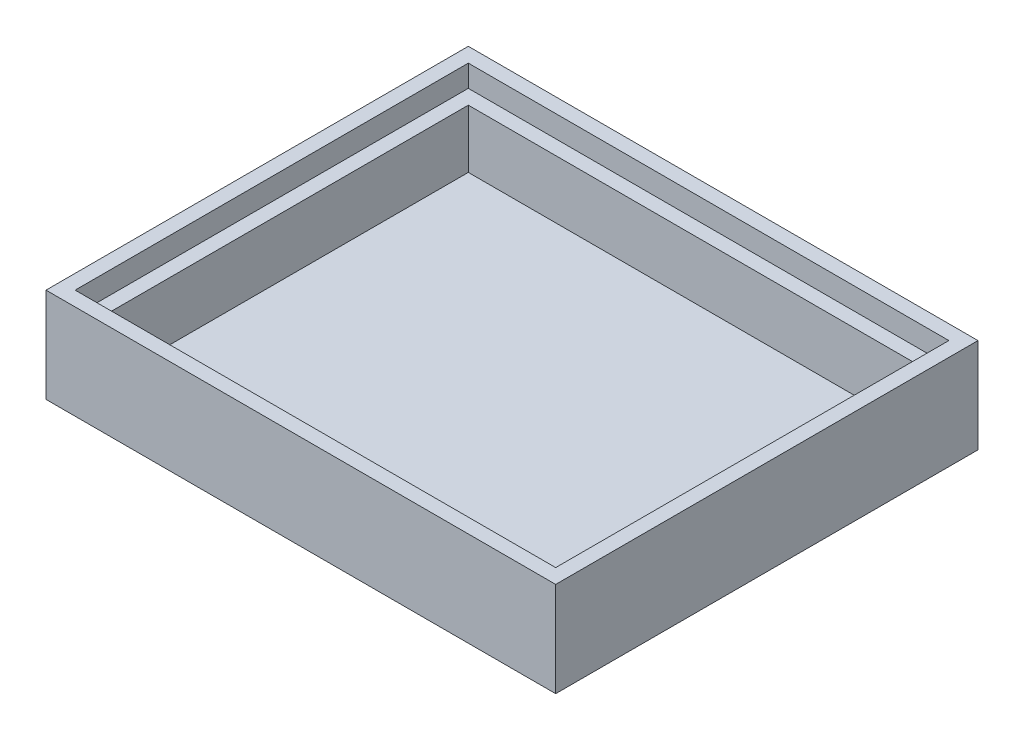
ISO-10303-21;
HEADER;
FILE_DESCRIPTION(('STEP AP214'),'2;1');
FILE_NAME('part.step','',(''),(''),'','','');
FILE_SCHEMA(('AUTOMOTIVE_DESIGN { 1 0 10303 214 1 1 1 1 }'));
ENDSEC;
DATA;
#1=APPLICATION_CONTEXT('core data for automotive mechanical design processes');
#2=APPLICATION_PROTOCOL_DEFINITION('international standard','automotive_design',2000,#1);
#3=PRODUCT_CONTEXT('',#1,'mechanical');
#4=PRODUCT('Part','Part','',(#3));
#5=PRODUCT_RELATED_PRODUCT_CATEGORY('part','',(#4));
#6=PRODUCT_DEFINITION_FORMATION('','',#4);
#7=PRODUCT_DEFINITION_CONTEXT('part definition',#1,'design');
#8=PRODUCT_DEFINITION('design','',#6,#7);
#9=PRODUCT_DEFINITION_SHAPE('','',#8);
#10=(LENGTH_UNIT() NAMED_UNIT(*) SI_UNIT(.MILLI.,.METRE.));
#11=(NAMED_UNIT(*) PLANE_ANGLE_UNIT() SI_UNIT($,.RADIAN.));
#12=(NAMED_UNIT(*) SI_UNIT($,.STERADIAN.) SOLID_ANGLE_UNIT());
#13=UNCERTAINTY_MEASURE_WITH_UNIT(LENGTH_MEASURE(1.E-05),#10,'distance_accuracy_value','');
#14=(GEOMETRIC_REPRESENTATION_CONTEXT(3) GLOBAL_UNCERTAINTY_ASSIGNED_CONTEXT((#13)) GLOBAL_UNIT_ASSIGNED_CONTEXT((#10,
#11,#12)) REPRESENTATION_CONTEXT('',''));
#15=CARTESIAN_POINT('',(0.,0.,0.));
#16=DIRECTION('',(0.,0.,1.));
#17=DIRECTION('',(1.,0.,0.));
#18=AXIS2_PLACEMENT_3D('',#15,#16,#17);
#19=CARTESIAN_POINT('',(0.,10.,0.));
#20=DIRECTION('',(0.,1.,0.));
#21=DIRECTION('',(0.,0.,1.));
#22=AXIS2_PLACEMENT_3D('',#19,#20,#21);
#23=PLANE('',#22);
#24=DIRECTION('',(1.,0.,0.));
#25=VECTOR('',#24,1.);
#26=CARTESIAN_POINT('',(4.00000000000001,10.,-4.));
#27=LINE('',#26,#25);
#28=CARTESIAN_POINT('',(4.00000000000001,10.,-4.));
#29=VERTEX_POINT('',#28);
#30=CARTESIAN_POINT('',(66.,10.,-4.));
#31=VERTEX_POINT('',#30);
#32=EDGE_CURVE('E202',#29,#31,#27,.T.);
#33=ORIENTED_EDGE('',*,*,#32,.F.);
#34=DIRECTION('',(0.,0.,1.));
#35=VECTOR('',#34,1.);
#36=CARTESIAN_POINT('',(4.,10.,-54.));
#37=LINE('',#36,#35);
#38=CARTESIAN_POINT('',(4.,10.,-54.));
#39=VERTEX_POINT('',#38);
#40=EDGE_CURVE('E199',#39,#29,#37,.T.);
#41=ORIENTED_EDGE('',*,*,#40,.F.);
#42=DIRECTION('',(-1.,0.,0.));
#43=VECTOR('',#42,1.);
#44=CARTESIAN_POINT('',(4.,10.,-54.));
#45=LINE('',#44,#43);
#46=CARTESIAN_POINT('',(66.,10.,-54.));
#47=VERTEX_POINT('',#46);
#48=EDGE_CURVE('E210',#47,#39,#45,.T.);
#49=ORIENTED_EDGE('',*,*,#48,.F.);
#50=DIRECTION('',(0.,0.,-1.));
#51=VECTOR('',#50,1.);
#52=CARTESIAN_POINT('',(66.,10.,-54.));
#53=LINE('',#52,#51);
#54=EDGE_CURVE('E206',#31,#47,#53,.T.);
#55=ORIENTED_EDGE('',*,*,#54,.F.);
#56=EDGE_LOOP('',(#33,#41,#49,#55));
#57=FACE_BOUND('',#56,.T.);
#58=DIRECTION('',(-1.,0.,0.));
#59=VECTOR('',#58,1.);
#60=CARTESIAN_POINT('',(2.,10.,-56.));
#61=LINE('',#60,#59);
#62=CARTESIAN_POINT('',(68.,10.,-56.));
#63=VERTEX_POINT('',#62);
#64=CARTESIAN_POINT('',(2.,10.,-56.));
#65=VERTEX_POINT('',#64);
#66=EDGE_CURVE('E141',#63,#65,#61,.T.);
#67=ORIENTED_EDGE('',*,*,#66,.T.);
#68=DIRECTION('',(0.,0.,1.));
#69=VECTOR('',#68,1.);
#70=CARTESIAN_POINT('',(2.,10.,-56.));
#71=LINE('',#70,#69);
#72=CARTESIAN_POINT('',(2.00000000000001,10.,-2.));
#73=VERTEX_POINT('',#72);
#74=EDGE_CURVE('E164',#65,#73,#71,.T.);
#75=ORIENTED_EDGE('',*,*,#74,.T.);
#76=DIRECTION('',(1.,0.,0.));
#77=VECTOR('',#76,1.);
#78=CARTESIAN_POINT('',(2.00000000000001,10.,-2.));
#79=LINE('',#78,#77);
#80=CARTESIAN_POINT('',(68.,10.,-2.));
#81=VERTEX_POINT('',#80);
#82=EDGE_CURVE('E147',#73,#81,#79,.T.);
#83=ORIENTED_EDGE('',*,*,#82,.T.);
#84=DIRECTION('',(0.,0.,-1.));
#85=VECTOR('',#84,1.);
#86=CARTESIAN_POINT('',(68.,10.,-56.));
#87=LINE('',#86,#85);
#88=EDGE_CURVE('E169',#81,#63,#87,.T.);
#89=ORIENTED_EDGE('',*,*,#88,.T.);
#90=EDGE_LOOP('',(#67,#75,#83,#89));
#91=FACE_BOUND('',#90,.T.);
#92=ADVANCED_FACE('F39',(#57,#91),#23,.T.);
#93=CARTESIAN_POINT('',(4.,10.,-54.));
#94=DIRECTION('',(1.,0.,0.));
#95=DIRECTION('',(0.,0.,-1.));
#96=AXIS2_PLACEMENT_3D('',#93,#94,#95);
#97=PLANE('',#96);
#98=DIRECTION('',(0.,0.,1.));
#99=VECTOR('',#98,1.);
#100=CARTESIAN_POINT('',(4.,2.,-54.));
#101=LINE('',#100,#99);
#102=CARTESIAN_POINT('',(4.,2.,-54.));
#103=VERTEX_POINT('',#102);
#104=CARTESIAN_POINT('',(4.00000000000001,2.,-4.));
#105=VERTEX_POINT('',#104);
#106=EDGE_CURVE('E198',#103,#105,#101,.T.);
#107=ORIENTED_EDGE('',*,*,#106,.F.);
#108=DIRECTION('',(0.,-1.,0.));
#109=VECTOR('',#108,1.);
#110=CARTESIAN_POINT('',(4.,10.,-54.));
#111=LINE('',#110,#109);
#112=EDGE_CURVE('E63',#39,#103,#111,.T.);
#113=ORIENTED_EDGE('',*,*,#112,.F.);
#114=ORIENTED_EDGE('',*,*,#40,.T.);
#115=DIRECTION('',(0.,-1.,0.));
#116=VECTOR('',#115,1.);
#117=CARTESIAN_POINT('',(4.00000000000001,10.,-4.));
#118=LINE('',#117,#116);
#119=EDGE_CURVE('E235',#29,#105,#118,.T.);
#120=ORIENTED_EDGE('',*,*,#119,.T.);
#121=EDGE_LOOP('',(#107,#113,#114,#120));
#122=FACE_BOUND('',#121,.T.);
#123=ADVANCED_FACE('F285',(#122),#97,.T.);
#124=CARTESIAN_POINT('',(4.00000000000001,10.,-4.));
#125=DIRECTION('',(0.,0.,-1.));
#126=DIRECTION('',(-1.,0.,0.));
#127=AXIS2_PLACEMENT_3D('',#124,#125,#126);
#128=PLANE('',#127);
#129=DIRECTION('',(1.,0.,0.));
#130=VECTOR('',#129,1.);
#131=CARTESIAN_POINT('',(4.00000000000001,2.,-4.));
#132=LINE('',#131,#130);
#133=CARTESIAN_POINT('',(66.,2.,-4.));
#134=VERTEX_POINT('',#133);
#135=EDGE_CURVE('E216',#105,#134,#132,.T.);
#136=ORIENTED_EDGE('',*,*,#135,.F.);
#137=ORIENTED_EDGE('',*,*,#119,.F.);
#138=ORIENTED_EDGE('',*,*,#32,.T.);
#139=DIRECTION('',(0.,-1.,0.));
#140=VECTOR('',#139,1.);
#141=CARTESIAN_POINT('',(66.,10.,-4.));
#142=LINE('',#141,#140);
#143=EDGE_CURVE('E232',#31,#134,#142,.T.);
#144=ORIENTED_EDGE('',*,*,#143,.T.);
#145=EDGE_LOOP('',(#136,#137,#138,#144));
#146=FACE_BOUND('',#145,.T.);
#147=ADVANCED_FACE('F291',(#146),#128,.T.);
#148=CARTESIAN_POINT('',(66.,10.,-54.));
#149=DIRECTION('',(-1.,0.,0.));
#150=DIRECTION('',(0.,0.,1.));
#151=AXIS2_PLACEMENT_3D('',#148,#149,#150);
#152=PLANE('',#151);
#153=DIRECTION('',(0.,0.,-1.));
#154=VECTOR('',#153,1.);
#155=CARTESIAN_POINT('',(66.,2.,-54.));
#156=LINE('',#155,#154);
#157=CARTESIAN_POINT('',(66.,2.,-54.));
#158=VERTEX_POINT('',#157);
#159=EDGE_CURVE('E220',#134,#158,#156,.T.);
#160=ORIENTED_EDGE('',*,*,#159,.F.);
#161=ORIENTED_EDGE('',*,*,#143,.F.);
#162=ORIENTED_EDGE('',*,*,#54,.T.);
#163=DIRECTION('',(0.,-1.,0.));
#164=VECTOR('',#163,1.);
#165=CARTESIAN_POINT('',(66.,10.,-54.));
#166=LINE('',#165,#164);
#167=EDGE_CURVE('E229',#47,#158,#166,.T.);
#168=ORIENTED_EDGE('',*,*,#167,.T.);
#169=EDGE_LOOP('',(#160,#161,#162,#168));
#170=FACE_BOUND('',#169,.T.);
#171=ADVANCED_FACE('F373',(#170),#152,.T.);
#172=CARTESIAN_POINT('',(4.,10.,-54.));
#173=DIRECTION('',(0.,0.,1.));
#174=DIRECTION('',(1.,0.,0.));
#175=AXIS2_PLACEMENT_3D('',#172,#173,#174);
#176=PLANE('',#175);
#177=DIRECTION('',(-1.,0.,0.));
#178=VECTOR('',#177,1.);
#179=CARTESIAN_POINT('',(4.,2.,-54.));
#180=LINE('',#179,#178);
#181=EDGE_CURVE('E203',#158,#103,#180,.T.);
#182=ORIENTED_EDGE('',*,*,#181,.F.);
#183=ORIENTED_EDGE('',*,*,#167,.F.);
#184=ORIENTED_EDGE('',*,*,#48,.T.);
#185=ORIENTED_EDGE('',*,*,#112,.T.);
#186=EDGE_LOOP('',(#182,#183,#184,#185));
#187=FACE_BOUND('',#186,.T.);
#188=ADVANCED_FACE('F301',(#187),#176,.T.);
#189=CARTESIAN_POINT('',(0.,2.,0.));
#190=DIRECTION('',(0.,-1.,0.));
#191=DIRECTION('',(0.,0.,-1.));
#192=AXIS2_PLACEMENT_3D('',#189,#190,#191);
#193=PLANE('',#192);
#194=ORIENTED_EDGE('',*,*,#181,.T.);
#195=ORIENTED_EDGE('',*,*,#106,.T.);
#196=ORIENTED_EDGE('',*,*,#135,.T.);
#197=ORIENTED_EDGE('',*,*,#159,.T.);
#198=EDGE_LOOP('',(#194,#195,#196,#197));
#199=FACE_BOUND('',#198,.T.);
#200=ADVANCED_FACE('F298',(#199),#193,.F.);
#201=CARTESIAN_POINT('',(0.,13.,0.));
#202=DIRECTION('',(0.,1.,0.));
#203=DIRECTION('',(0.,0.,1.));
#204=AXIS2_PLACEMENT_3D('',#201,#202,#203);
#205=PLANE('',#204);
#206=DIRECTION('',(-1.,0.,0.));
#207=VECTOR('',#206,1.);
#208=CARTESIAN_POINT('',(70.,13.,-58.));
#209=LINE('',#208,#207);
#210=CARTESIAN_POINT('',(70.,13.,-58.));
#211=VERTEX_POINT('',#210);
#212=CARTESIAN_POINT('',(0.,13.,-58.));
#213=VERTEX_POINT('',#212);
#214=EDGE_CURVE('E149',#211,#213,#209,.T.);
#215=ORIENTED_EDGE('',*,*,#214,.T.);
#216=DIRECTION('',(0.,0.,1.));
#217=VECTOR('',#216,1.);
#218=CARTESIAN_POINT('',(0.,13.,-58.));
#219=LINE('',#218,#217);
#220=CARTESIAN_POINT('',(0.,13.,0.));
#221=VERTEX_POINT('',#220);
#222=EDGE_CURVE('E186',#213,#221,#219,.T.);
#223=ORIENTED_EDGE('',*,*,#222,.T.);
#224=DIRECTION('',(1.,0.,0.));
#225=VECTOR('',#224,1.);
#226=CARTESIAN_POINT('',(0.,13.,0.));
#227=LINE('',#226,#225);
#228=CARTESIAN_POINT('',(70.,13.,0.));
#229=VERTEX_POINT('',#228);
#230=EDGE_CURVE('E190',#221,#229,#227,.T.);
#231=ORIENTED_EDGE('',*,*,#230,.T.);
#232=DIRECTION('',(0.,0.,-1.));
#233=VECTOR('',#232,1.);
#234=CARTESIAN_POINT('',(70.,13.,0.));
#235=LINE('',#234,#233);
#236=EDGE_CURVE('E194',#229,#211,#235,.T.);
#237=ORIENTED_EDGE('',*,*,#236,.T.);
#238=EDGE_LOOP('',(#215,#223,#231,#237));
#239=FACE_BOUND('',#238,.T.);
#240=DIRECTION('',(1.,0.,0.));
#241=VECTOR('',#240,1.);
#242=CARTESIAN_POINT('',(2.00000000000001,13.,-2.));
#243=LINE('',#242,#241);
#244=CARTESIAN_POINT('',(2.00000000000001,13.,-2.));
#245=VERTEX_POINT('',#244);
#246=CARTESIAN_POINT('',(68.,13.,-2.));
#247=VERTEX_POINT('',#246);
#248=EDGE_CURVE('E140',#245,#247,#243,.T.);
#249=ORIENTED_EDGE('',*,*,#248,.F.);
#250=DIRECTION('',(0.,0.,1.));
#251=VECTOR('',#250,1.);
#252=CARTESIAN_POINT('',(2.,13.,-56.));
#253=LINE('',#252,#251);
#254=CARTESIAN_POINT('',(2.,13.,-56.));
#255=VERTEX_POINT('',#254);
#256=EDGE_CURVE('E131',#255,#245,#253,.T.);
#257=ORIENTED_EDGE('',*,*,#256,.F.);
#258=DIRECTION('',(-1.,0.,0.));
#259=VECTOR('',#258,1.);
#260=CARTESIAN_POINT('',(2.,13.,-56.));
#261=LINE('',#260,#259);
#262=CARTESIAN_POINT('',(68.,13.,-56.));
#263=VERTEX_POINT('',#262);
#264=EDGE_CURVE('E159',#263,#255,#261,.T.);
#265=ORIENTED_EDGE('',*,*,#264,.F.);
#266=DIRECTION('',(0.,0.,-1.));
#267=VECTOR('',#266,1.);
#268=CARTESIAN_POINT('',(68.,13.,-56.));
#269=LINE('',#268,#267);
#270=EDGE_CURVE('E155',#247,#263,#269,.T.);
#271=ORIENTED_EDGE('',*,*,#270,.F.);
#272=EDGE_LOOP('',(#249,#257,#265,#271));
#273=FACE_BOUND('',#272,.T.);
#274=ADVANCED_FACE('F153',(#239,#273),#205,.T.);
#275=CARTESIAN_POINT('',(2.,13.,-56.));
#276=DIRECTION('',(1.,0.,0.));
#277=DIRECTION('',(0.,0.,-1.));
#278=AXIS2_PLACEMENT_3D('',#275,#276,#277);
#279=PLANE('',#278);
#280=ORIENTED_EDGE('',*,*,#74,.F.);
#281=DIRECTION('',(0.,-1.,0.));
#282=VECTOR('',#281,1.);
#283=CARTESIAN_POINT('',(2.,13.,-56.));
#284=LINE('',#283,#282);
#285=EDGE_CURVE('E55',#255,#65,#284,.T.);
#286=ORIENTED_EDGE('',*,*,#285,.F.);
#287=ORIENTED_EDGE('',*,*,#256,.T.);
#288=DIRECTION('',(0.,-1.,0.));
#289=VECTOR('',#288,1.);
#290=CARTESIAN_POINT('',(2.00000000000001,13.,-2.));
#291=LINE('',#290,#289);
#292=EDGE_CURVE('E134',#245,#73,#291,.T.);
#293=ORIENTED_EDGE('',*,*,#292,.T.);
#294=EDGE_LOOP('',(#280,#286,#287,#293));
#295=FACE_BOUND('',#294,.T.);
#296=ADVANCED_FACE('F133',(#295),#279,.T.);
#297=CARTESIAN_POINT('',(2.00000000000001,13.,-2.));
#298=DIRECTION('',(0.,0.,-1.));
#299=DIRECTION('',(-1.,0.,0.));
#300=AXIS2_PLACEMENT_3D('',#297,#298,#299);
#301=PLANE('',#300);
#302=ORIENTED_EDGE('',*,*,#82,.F.);
#303=ORIENTED_EDGE('',*,*,#292,.F.);
#304=ORIENTED_EDGE('',*,*,#248,.T.);
#305=DIRECTION('',(0.,-1.,0.));
#306=VECTOR('',#305,1.);
#307=CARTESIAN_POINT('',(68.,13.,-2.));
#308=LINE('',#307,#306);
#309=EDGE_CURVE('E150',#247,#81,#308,.T.);
#310=ORIENTED_EDGE('',*,*,#309,.T.);
#311=EDGE_LOOP('',(#302,#303,#304,#310));
#312=FACE_BOUND('',#311,.T.);
#313=ADVANCED_FACE('F144',(#312),#301,.T.);
#314=CARTESIAN_POINT('',(68.,13.,-56.));
#315=DIRECTION('',(-1.,0.,0.));
#316=DIRECTION('',(0.,0.,1.));
#317=AXIS2_PLACEMENT_3D('',#314,#315,#316);
#318=PLANE('',#317);
#319=ORIENTED_EDGE('',*,*,#88,.F.);
#320=ORIENTED_EDGE('',*,*,#309,.F.);
#321=ORIENTED_EDGE('',*,*,#270,.T.);
#322=DIRECTION('',(0.,-1.,0.));
#323=VECTOR('',#322,1.);
#324=CARTESIAN_POINT('',(68.,13.,-56.));
#325=LINE('',#324,#323);
#326=EDGE_CURVE('E178',#263,#63,#325,.T.);
#327=ORIENTED_EDGE('',*,*,#326,.T.);
#328=EDGE_LOOP('',(#319,#320,#321,#327));
#329=FACE_BOUND('',#328,.T.);
#330=ADVANCED_FACE('F415',(#329),#318,.T.);
#331=CARTESIAN_POINT('',(2.,13.,-56.));
#332=DIRECTION('',(0.,0.,1.));
#333=DIRECTION('',(1.,0.,0.));
#334=AXIS2_PLACEMENT_3D('',#331,#332,#333);
#335=PLANE('',#334);
#336=ORIENTED_EDGE('',*,*,#66,.F.);
#337=ORIENTED_EDGE('',*,*,#326,.F.);
#338=ORIENTED_EDGE('',*,*,#264,.T.);
#339=ORIENTED_EDGE('',*,*,#285,.T.);
#340=EDGE_LOOP('',(#336,#337,#338,#339));
#341=FACE_BOUND('',#340,.T.);
#342=ADVANCED_FACE('F305',(#341),#335,.T.);
#343=CARTESIAN_POINT('',(0.,0.,0.));
#344=DIRECTION('',(0.,-1.,0.));
#345=DIRECTION('',(0.,0.,-1.));
#346=AXIS2_PLACEMENT_3D('',#343,#344,#345);
#347=PLANE('',#346);
#348=DIRECTION('',(0.,0.,1.));
#349=VECTOR('',#348,1.);
#350=CARTESIAN_POINT('',(0.,0.,0.));
#351=LINE('',#350,#349);
#352=CARTESIAN_POINT('',(0.,0.,-58.));
#353=VERTEX_POINT('',#352);
#354=CARTESIAN_POINT('',(0.,0.,0.));
#355=VERTEX_POINT('',#354);
#356=EDGE_CURVE('E239',#353,#355,#351,.T.);
#357=ORIENTED_EDGE('',*,*,#356,.F.);
#358=DIRECTION('',(-1.,0.,0.));
#359=VECTOR('',#358,1.);
#360=CARTESIAN_POINT('',(0.,0.,-58.));
#361=LINE('',#360,#359);
#362=CARTESIAN_POINT('',(70.,0.,-58.));
#363=VERTEX_POINT('',#362);
#364=EDGE_CURVE('E249',#363,#353,#361,.T.);
#365=ORIENTED_EDGE('',*,*,#364,.F.);
#366=DIRECTION('',(0.,0.,-1.));
#367=VECTOR('',#366,1.);
#368=CARTESIAN_POINT('',(70.,0.,0.));
#369=LINE('',#368,#367);
#370=CARTESIAN_POINT('',(70.,0.,0.));
#371=VERTEX_POINT('',#370);
#372=EDGE_CURVE('E246',#371,#363,#369,.T.);
#373=ORIENTED_EDGE('',*,*,#372,.F.);
#374=DIRECTION('',(1.,0.,0.));
#375=VECTOR('',#374,1.);
#376=CARTESIAN_POINT('',(0.,0.,0.));
#377=LINE('',#376,#375);
#378=EDGE_CURVE('E243',#355,#371,#377,.T.);
#379=ORIENTED_EDGE('',*,*,#378,.F.);
#380=EDGE_LOOP('',(#357,#365,#373,#379));
#381=FACE_BOUND('',#380,.T.);
#382=ADVANCED_FACE('F270',(#381),#347,.T.);
#383=CARTESIAN_POINT('',(0.,2.,-58.));
#384=DIRECTION('',(0.,0.,1.));
#385=DIRECTION('',(1.,0.,0.));
#386=AXIS2_PLACEMENT_3D('',#383,#384,#385);
#387=PLANE('',#386);
#388=ORIENTED_EDGE('',*,*,#364,.T.);
#389=DIRECTION('',(0.,-1.,0.));
#390=VECTOR('',#389,1.);
#391=CARTESIAN_POINT('',(0.,2.,-58.));
#392=LINE('',#391,#390);
#393=EDGE_CURVE('E252',#213,#353,#392,.T.);
#394=ORIENTED_EDGE('',*,*,#393,.F.);
#395=ORIENTED_EDGE('',*,*,#214,.F.);
#396=DIRECTION('',(0.,-1.,0.));
#397=VECTOR('',#396,1.);
#398=CARTESIAN_POINT('',(70.,2.,-58.));
#399=LINE('',#398,#397);
#400=EDGE_CURVE('E256',#211,#363,#399,.T.);
#401=ORIENTED_EDGE('',*,*,#400,.T.);
#402=EDGE_LOOP('',(#388,#394,#395,#401));
#403=FACE_BOUND('',#402,.T.);
#404=ADVANCED_FACE('F272',(#403),#387,.F.);
#405=CARTESIAN_POINT('',(70.,2.,0.));
#406=DIRECTION('',(-1.,0.,0.));
#407=DIRECTION('',(0.,0.,1.));
#408=AXIS2_PLACEMENT_3D('',#405,#406,#407);
#409=PLANE('',#408);
#410=ORIENTED_EDGE('',*,*,#372,.T.);
#411=ORIENTED_EDGE('',*,*,#400,.F.);
#412=ORIENTED_EDGE('',*,*,#236,.F.);
#413=DIRECTION('',(0.,-1.,0.));
#414=VECTOR('',#413,1.);
#415=CARTESIAN_POINT('',(70.,2.,0.));
#416=LINE('',#415,#414);
#417=EDGE_CURVE('E48',#229,#371,#416,.T.);
#418=ORIENTED_EDGE('',*,*,#417,.T.);
#419=EDGE_LOOP('',(#410,#411,#412,#418));
#420=FACE_BOUND('',#419,.T.);
#421=ADVANCED_FACE('F264',(#420),#409,.F.);
#422=CARTESIAN_POINT('',(0.,2.,0.));
#423=DIRECTION('',(0.,0.,-1.));
#424=DIRECTION('',(-1.,0.,0.));
#425=AXIS2_PLACEMENT_3D('',#422,#423,#424);
#426=PLANE('',#425);
#427=ORIENTED_EDGE('',*,*,#378,.T.);
#428=ORIENTED_EDGE('',*,*,#417,.F.);
#429=ORIENTED_EDGE('',*,*,#230,.F.);
#430=DIRECTION('',(0.,-1.,0.));
#431=VECTOR('',#430,1.);
#432=CARTESIAN_POINT('',(0.,2.,0.));
#433=LINE('',#432,#431);
#434=EDGE_CURVE('E11',#221,#355,#433,.T.);
#435=ORIENTED_EDGE('',*,*,#434,.T.);
#436=EDGE_LOOP('',(#427,#428,#429,#435));
#437=FACE_BOUND('',#436,.T.);
#438=ADVANCED_FACE('F277',(#437),#426,.F.);
#439=CARTESIAN_POINT('',(0.,2.,0.));
#440=DIRECTION('',(1.,0.,0.));
#441=DIRECTION('',(0.,0.,-1.));
#442=AXIS2_PLACEMENT_3D('',#439,#440,#441);
#443=PLANE('',#442);
#444=ORIENTED_EDGE('',*,*,#356,.T.);
#445=ORIENTED_EDGE('',*,*,#434,.F.);
#446=ORIENTED_EDGE('',*,*,#222,.F.);
#447=ORIENTED_EDGE('',*,*,#393,.T.);
#448=EDGE_LOOP('',(#444,#445,#446,#447));
#449=FACE_BOUND('',#448,.T.);
#450=ADVANCED_FACE('F41',(#449),#443,.F.);
#451=CLOSED_SHELL('',(#92,#123,#147,#171,#188,#200,#274,#296,#313,#330,#342,#382,#404,#421,#438,#450));
#452=MANIFOLD_SOLID_BREP('B2',#451);
#453=ADVANCED_BREP_SHAPE_REPRESENTATION('',(#18,#452),#14);
#454=SHAPE_DEFINITION_REPRESENTATION(#9,#453);
ENDSEC;
END-ISO-10303-21;
